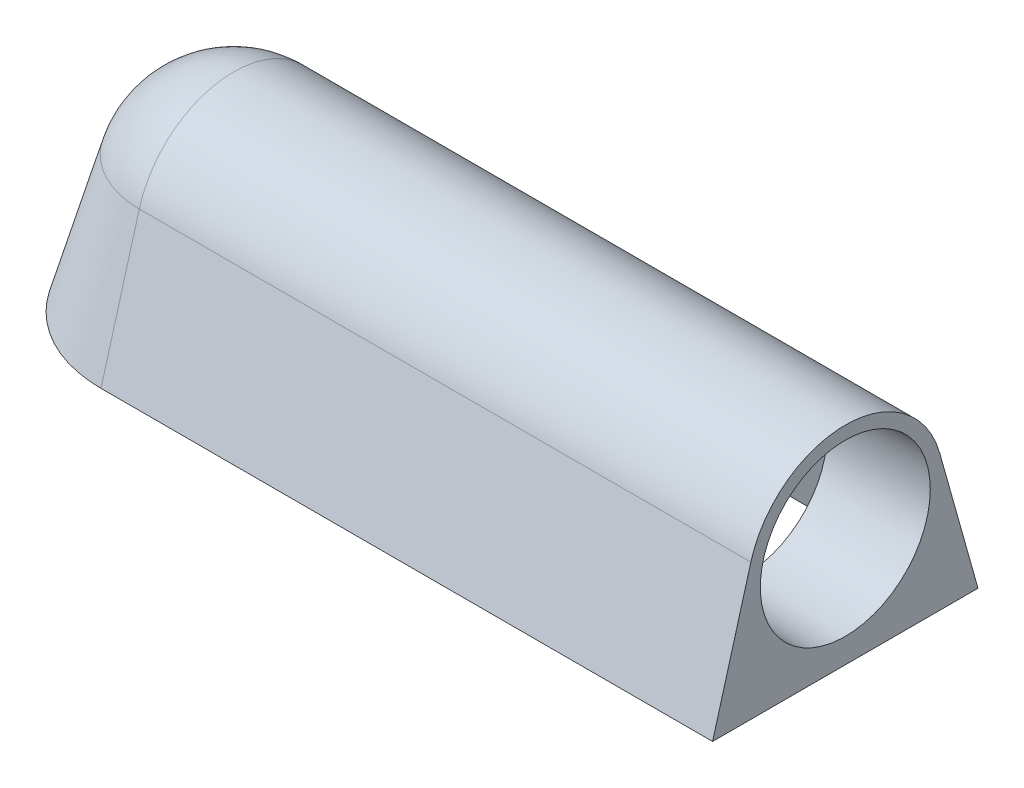
ISO-10303-21;
HEADER;
FILE_DESCRIPTION(('STEP AP214'),'2;1');
FILE_NAME('part.step','',(''),(''),'','','');
FILE_SCHEMA(('AUTOMOTIVE_DESIGN { 1 0 10303 214 1 1 1 1 }'));
ENDSEC;
DATA;
#1=APPLICATION_CONTEXT('core data for automotive mechanical design processes');
#2=APPLICATION_PROTOCOL_DEFINITION('international standard','automotive_design',2000,#1);
#3=PRODUCT_CONTEXT('',#1,'mechanical');
#4=PRODUCT('Part','Part','',(#3));
#5=PRODUCT_RELATED_PRODUCT_CATEGORY('part','',(#4));
#6=PRODUCT_DEFINITION_FORMATION('','',#4);
#7=PRODUCT_DEFINITION_CONTEXT('part definition',#1,'design');
#8=PRODUCT_DEFINITION('design','',#6,#7);
#9=PRODUCT_DEFINITION_SHAPE('','',#8);
#10=(LENGTH_UNIT() NAMED_UNIT(*) SI_UNIT(.MILLI.,.METRE.));
#11=(NAMED_UNIT(*) PLANE_ANGLE_UNIT() SI_UNIT($,.RADIAN.));
#12=(NAMED_UNIT(*) SI_UNIT($,.STERADIAN.) SOLID_ANGLE_UNIT());
#13=UNCERTAINTY_MEASURE_WITH_UNIT(LENGTH_MEASURE(1.E-05),#10,'distance_accuracy_value','');
#14=(GEOMETRIC_REPRESENTATION_CONTEXT(3) GLOBAL_UNCERTAINTY_ASSIGNED_CONTEXT((#13)) GLOBAL_UNIT_ASSIGNED_CONTEXT((#10,
#11,#12)) REPRESENTATION_CONTEXT('',''));
#15=CARTESIAN_POINT('',(0.,0.,0.));
#16=DIRECTION('',(0.,0.,1.));
#17=DIRECTION('',(1.,0.,0.));
#18=AXIS2_PLACEMENT_3D('',#15,#16,#17);
#19=CARTESIAN_POINT('',(0.,9.5,0.));
#20=DIRECTION('',(0.,-1.,0.));
#21=DIRECTION('',(0.,0.,1.));
#22=AXIS2_PLACEMENT_3D('',#19,#20,#21);
#23=SPHERICAL_SURFACE('',#22,8.5);
#24=CARTESIAN_POINT('',(0.,11.8002712503408,0.));
#25=DIRECTION('',(0.,-1.,0.));
#26=DIRECTION('',(0.,0.,-1.));
#27=AXIS2_PLACEMENT_3D('',#24,#25,#26);
#28=CIRCLE('',#27,8.18283277202067);
#29=CARTESIAN_POINT('',(0.,11.8002712503408,8.18283277202068));
#30=VERTEX_POINT('',#29);
#31=CARTESIAN_POINT('',(0.,11.8002712503408,-8.18283277202067));
#32=VERTEX_POINT('',#31);
#33=EDGE_CURVE('E11',#30,#32,#28,.T.);
#34=ORIENTED_EDGE('',*,*,#33,.F.);
#35=CARTESIAN_POINT('',(0.,9.5,0.));
#36=DIRECTION('',(-1.,0.,0.));
#37=DIRECTION('',(0.,0.,-1.));
#38=AXIS2_PLACEMENT_3D('',#35,#36,#37);
#39=CIRCLE('',#38,8.5);
#40=EDGE_CURVE('E227',#30,#32,#39,.T.);
#41=ORIENTED_EDGE('',*,*,#40,.T.);
#42=EDGE_LOOP('',(#34,#41));
#43=FACE_BOUND('',#42,.T.);
#44=ADVANCED_FACE('F32',(#43),#23,.T.);
#45=CARTESIAN_POINT('',(0.,0.,0.));
#46=DIRECTION('',(0.,-1.,0.));
#47=DIRECTION('',(0.,0.,-1.));
#48=AXIS2_PLACEMENT_3D('',#45,#46,#47);
#49=CONICAL_SURFACE('',#48,11.5,0.274037157244348);
#50=CARTESIAN_POINT('',(0.,0.,0.));
#51=DIRECTION('',(0.,-1.,0.));
#52=DIRECTION('',(0.,0.,-1.));
#53=AXIS2_PLACEMENT_3D('',#50,#51,#52);
#54=CIRCLE('',#53,11.5);
#55=CARTESIAN_POINT('',(0.,0.,11.5));
#56=VERTEX_POINT('',#55);
#57=CARTESIAN_POINT('',(0.,0.,-11.5));
#58=VERTEX_POINT('',#57);
#59=EDGE_CURVE('E39',#56,#58,#54,.T.);
#60=ORIENTED_EDGE('',*,*,#59,.F.);
#61=DIRECTION('',(0.,0.96268620847302,-0.270620147098919));
#62=VECTOR('',#61,1.);
#63=CARTESIAN_POINT('',(0.,11.8002712503408,8.18283277202068));
#64=LINE('',#63,#62);
#65=EDGE_CURVE('E223',#56,#30,#64,.T.);
#66=ORIENTED_EDGE('',*,*,#65,.T.);
#67=ORIENTED_EDGE('',*,*,#33,.T.);
#68=DIRECTION('',(0.,0.96268620847302,0.270620147098919));
#69=VECTOR('',#68,1.);
#70=CARTESIAN_POINT('',(0.,11.8002712503408,-8.18283277202067));
#71=LINE('',#70,#69);
#72=EDGE_CURVE('E224',#58,#32,#71,.T.);
#73=ORIENTED_EDGE('',*,*,#72,.F.);
#74=EDGE_LOOP('',(#60,#66,#67,#73));
#75=FACE_BOUND('',#74,.T.);
#76=ADVANCED_FACE('F210',(#75),#49,.T.);
#77=CARTESIAN_POINT('',(0.,0.,11.5));
#78=DIRECTION('',(0.,-1.,0.));
#79=DIRECTION('',(0.,0.,-1.));
#80=AXIS2_PLACEMENT_3D('',#77,#78,#79);
#81=PLANE('',#80);
#82=CARTESIAN_POINT('',(0.,0.,0.));
#83=DIRECTION('',(0.,-1.,0.));
#84=DIRECTION('',(0.,0.,-1.));
#85=AXIS2_PLACEMENT_3D('',#82,#83,#84);
#86=CIRCLE('',#85,10.2534879076502);
#87=CARTESIAN_POINT('',(0.,0.,10.2534879076502));
#88=VERTEX_POINT('',#87);
#89=CARTESIAN_POINT('',(-1.04083408558608E-13,0.,-10.2534879076502));
#90=VERTEX_POINT('',#89);
#91=EDGE_CURVE('E129',#88,#90,#86,.T.);
#92=ORIENTED_EDGE('',*,*,#91,.F.);
#93=DIRECTION('',(-1.,0.,0.));
#94=VECTOR('',#93,1.);
#95=CARTESIAN_POINT('',(53.0000000000001,0.,10.2534879076498));
#96=LINE('',#95,#94);
#97=CARTESIAN_POINT('',(51.8000000000001,0.,10.2534879076498));
#98=VERTEX_POINT('',#97);
#99=EDGE_CURVE('E143',#98,#88,#96,.T.);
#100=ORIENTED_EDGE('',*,*,#99,.F.);
#101=DIRECTION('',(0.,0.,-1.));
#102=VECTOR('',#101,1.);
#103=CARTESIAN_POINT('',(51.8,0.,-3.62711865595565E-13));
#104=LINE('',#103,#102);
#105=CARTESIAN_POINT('',(51.7999999999999,0.,-10.2534879076506));
#106=VERTEX_POINT('',#105);
#107=EDGE_CURVE('E46',#98,#106,#104,.T.);
#108=ORIENTED_EDGE('',*,*,#107,.T.);
#109=DIRECTION('',(-1.,0.,0.));
#110=VECTOR('',#109,1.);
#111=CARTESIAN_POINT('',(0.,0.,-10.2534879076502));
#112=LINE('',#111,#110);
#113=EDGE_CURVE('E151',#106,#90,#112,.T.);
#114=ORIENTED_EDGE('',*,*,#113,.T.);
#115=EDGE_LOOP('',(#92,#100,#108,#114));
#116=FACE_BOUND('',#115,.T.);
#117=ORIENTED_EDGE('',*,*,#59,.T.);
#118=DIRECTION('',(-1.,0.,0.));
#119=VECTOR('',#118,1.);
#120=CARTESIAN_POINT('',(52.9999999999999,0.,-11.5000000000004));
#121=LINE('',#120,#119);
#122=CARTESIAN_POINT('',(52.9999999999999,0.,-11.5000000000004));
#123=VERTEX_POINT('',#122);
#124=EDGE_CURVE('E235',#123,#58,#121,.T.);
#125=ORIENTED_EDGE('',*,*,#124,.F.);
#126=DIRECTION('',(0.,0.,-1.));
#127=VECTOR('',#126,1.);
#128=CARTESIAN_POINT('',(53.0000000000001,0.,11.4999999999996));
#129=LINE('',#128,#127);
#130=CARTESIAN_POINT('',(53.0000000000001,0.,11.4999999999996));
#131=VERTEX_POINT('',#130);
#132=EDGE_CURVE('E245',#131,#123,#129,.T.);
#133=ORIENTED_EDGE('',*,*,#132,.F.);
#134=DIRECTION('',(-1.,0.,0.));
#135=VECTOR('',#134,1.);
#136=CARTESIAN_POINT('',(53.0000000000001,0.,11.4999999999996));
#137=LINE('',#136,#135);
#138=EDGE_CURVE('E233',#131,#56,#137,.T.);
#139=ORIENTED_EDGE('',*,*,#138,.T.);
#140=EDGE_LOOP('',(#117,#125,#133,#139));
#141=FACE_BOUND('',#140,.T.);
#142=ADVANCED_FACE('F207',(#116,#141),#81,.T.);
#143=CARTESIAN_POINT('',(53.0000000000001,11.8002712503408,8.1828327720203));
#144=DIRECTION('',(0.,-0.270620147098919,-0.96268620847302));
#145=DIRECTION('',(0.,0.96268620847302,-0.270620147098919));
#146=AXIS2_PLACEMENT_3D('',#143,#144,#145);
#147=PLANE('',#146);
#148=ORIENTED_EDGE('',*,*,#65,.F.);
#149=ORIENTED_EDGE('',*,*,#138,.F.);
#150=DIRECTION('',(0.,-0.96268620847302,0.270620147098919));
#151=VECTOR('',#150,1.);
#152=CARTESIAN_POINT('',(53.0000000000001,11.8002712503408,8.1828327720203));
#153=LINE('',#152,#151);
#154=CARTESIAN_POINT('',(53.0000000000001,11.8002712503408,8.18283277202031));
#155=VERTEX_POINT('',#154);
#156=EDGE_CURVE('E247',#155,#131,#153,.T.);
#157=ORIENTED_EDGE('',*,*,#156,.F.);
#158=DIRECTION('',(-1.,0.,0.));
#159=VECTOR('',#158,1.);
#160=CARTESIAN_POINT('',(53.0000000000001,11.8002712503408,8.18283277202031));
#161=LINE('',#160,#159);
#162=EDGE_CURVE('E238',#155,#30,#161,.T.);
#163=ORIENTED_EDGE('',*,*,#162,.T.);
#164=EDGE_LOOP('',(#148,#149,#157,#163));
#165=FACE_BOUND('',#164,.T.);
#166=ADVANCED_FACE('F203',(#165),#147,.F.);
#167=CARTESIAN_POINT('',(52.9999999999999,0.,-11.5000000000004));
#168=DIRECTION('',(0.,-0.270620147098919,0.96268620847302));
#169=DIRECTION('',(0.,-0.96268620847302,-0.270620147098919));
#170=AXIS2_PLACEMENT_3D('',#167,#168,#169);
#171=PLANE('',#170);
#172=ORIENTED_EDGE('',*,*,#72,.T.);
#173=DIRECTION('',(-1.,0.,0.));
#174=VECTOR('',#173,1.);
#175=CARTESIAN_POINT('',(52.9999999999999,11.8002712503408,-8.18283277202105));
#176=LINE('',#175,#174);
#177=CARTESIAN_POINT('',(52.9999999999999,11.8002712503408,-8.18283277202105));
#178=VERTEX_POINT('',#177);
#179=EDGE_CURVE('E54',#178,#32,#176,.T.);
#180=ORIENTED_EDGE('',*,*,#179,.F.);
#181=DIRECTION('',(0.,0.96268620847302,0.270620147098919));
#182=VECTOR('',#181,1.);
#183=CARTESIAN_POINT('',(52.9999999999999,0.,-11.5000000000004));
#184=LINE('',#183,#182);
#185=EDGE_CURVE('E243',#123,#178,#184,.T.);
#186=ORIENTED_EDGE('',*,*,#185,.F.);
#187=ORIENTED_EDGE('',*,*,#124,.T.);
#188=EDGE_LOOP('',(#172,#180,#186,#187));
#189=FACE_BOUND('',#188,.T.);
#190=ADVANCED_FACE('F200',(#189),#171,.F.);
#191=CARTESIAN_POINT('',(53.,9.5,-3.70028310750965E-13));
#192=DIRECTION('',(-1.,0.,0.));
#193=DIRECTION('',(0.,0.,1.));
#194=AXIS2_PLACEMENT_3D('',#191,#192,#193);
#195=CYLINDRICAL_SURFACE('',#194,8.5);
#196=ORIENTED_EDGE('',*,*,#40,.F.);
#197=ORIENTED_EDGE('',*,*,#162,.F.);
#198=CARTESIAN_POINT('',(53.,9.5,-3.70028310750965E-13));
#199=DIRECTION('',(1.,0.,0.));
#200=DIRECTION('',(0.,0.,-1.));
#201=AXIS2_PLACEMENT_3D('',#198,#199,#200);
#202=CIRCLE('',#201,8.5);
#203=EDGE_CURVE('E241',#178,#155,#202,.T.);
#204=ORIENTED_EDGE('',*,*,#203,.F.);
#205=ORIENTED_EDGE('',*,*,#179,.T.);
#206=EDGE_LOOP('',(#196,#197,#204,#205));
#207=FACE_BOUND('',#206,.T.);
#208=ADVANCED_FACE('F196',(#207),#195,.T.);
#209=CARTESIAN_POINT('',(53.,9.5,-3.70028310750965E-13));
#210=DIRECTION('',(1.,0.,0.));
#211=DIRECTION('',(0.,0.,-1.));
#212=AXIS2_PLACEMENT_3D('',#209,#210,#211);
#213=PLANE('',#212);
#214=CARTESIAN_POINT('',(52.9999999999551,9.5,-3.70146621686551E-13));
#215=DIRECTION('',(1.,0.,0.));
#216=DIRECTION('',(0.,0.,-1.));
#217=AXIS2_PLACEMENT_3D('',#214,#215,#216);
#218=CIRCLE('',#217,7.366);
#219=CARTESIAN_POINT('',(52.999999999955,9.5,-7.36600000000037));
#220=VERTEX_POINT('',#219);
#221=EDGE_CURVE('E250',#220,#220,#218,.T.);
#222=ORIENTED_EDGE('',*,*,#221,.F.);
#223=EDGE_LOOP('',(#222));
#224=FACE_BOUND('',#223,.T.);
#225=ORIENTED_EDGE('',*,*,#156,.T.);
#226=ORIENTED_EDGE('',*,*,#132,.T.);
#227=ORIENTED_EDGE('',*,*,#185,.T.);
#228=ORIENTED_EDGE('',*,*,#203,.T.);
#229=EDGE_LOOP('',(#225,#226,#227,#228));
#230=FACE_BOUND('',#229,.T.);
#231=ADVANCED_FACE('F192',(#224,#230),#213,.T.);
#232=CARTESIAN_POINT('',(52.9999999999551,9.5,-3.70146621686551E-13));
#233=DIRECTION('',(1.,0.,0.));
#234=DIRECTION('',(0.,0.,-1.));
#235=AXIS2_PLACEMENT_3D('',#232,#233,#234);
#236=CONICAL_SURFACE('',#235,7.366,0.0349065850398867);
#237=CARTESIAN_POINT('',(44.3639999999551,9.5,-3.09312936049889E-13));
#238=DIRECTION('',(1.,0.,0.));
#239=DIRECTION('',(0.,0.,-1.));
#240=AXIS2_PLACEMENT_3D('',#237,#238,#239);
#241=CIRCLE('',#240,7.06442423466926);
#242=CARTESIAN_POINT('',(44.363999999955,9.5,-7.06442423466957));
#243=VERTEX_POINT('',#242);
#244=EDGE_CURVE('E251',#243,#243,#241,.T.);
#245=ORIENTED_EDGE('',*,*,#244,.F.);
#246=EDGE_LOOP('',(#245));
#247=FACE_BOUND('',#246,.T.);
#248=ORIENTED_EDGE('',*,*,#221,.T.);
#249=EDGE_LOOP('',(#248));
#250=FACE_BOUND('',#249,.T.);
#251=ADVANCED_FACE('F188',(#247,#250),#236,.F.);
#252=CARTESIAN_POINT('',(53.,11.4755270738221,7.02760932185268));
#253=DIRECTION('',(0.,-0.270620147098919,-0.96268620847302));
#254=DIRECTION('',(0.,0.96268620847302,-0.270620147098919));
#255=AXIS2_PLACEMENT_3D('',#252,#253,#254);
#256=PLANE('',#255);
#257=DIRECTION('',(0.,-0.96268620847302,0.270620147098919));
#258=VECTOR('',#257,1.);
#259=CARTESIAN_POINT('',(44.3639999999551,11.4755270738221,7.02760932185274));
#260=LINE('',#259,#258);
#261=CARTESIAN_POINT('',(44.3639999999551,11.4755270738221,7.02760932185274));
#262=VERTEX_POINT('',#261);
#263=CARTESIAN_POINT('',(44.3639999999551,7.74422704214361,8.07651285298849));
#264=VERTEX_POINT('',#263);
#265=EDGE_CURVE('E258',#262,#264,#260,.T.);
#266=ORIENTED_EDGE('',*,*,#265,.T.);
#267=CARTESIAN_POINT('',(64.7275807946575,6.44708054759679,8.44115293204371));
#268=CARTESIAN_POINT('',(63.6500352944031,6.5093351433632,8.42365257968008));
#269=CARTESIAN_POINT('',(62.5725371180742,6.57234431265899,8.40594010960071));
#270=CARTESIAN_POINT('',(60.4176496541625,6.70007451351936,8.37003394885845));
#271=CARTESIAN_POINT('',(59.3402603666462,6.76479554612519,8.35184025790285));
#272=CARTESIAN_POINT('',(56.1083381456672,6.96182680158969,8.29645291894694));
#273=CARTESIAN_POINT('',(53.9539918594332,7.09700856817742,8.25845205299803));
#274=CARTESIAN_POINT('',(50.7229863747897,7.30734000712617,8.19932590737879));
#275=CARTESIAN_POINT('',(49.6460613591914,7.37871090231477,8.17926287751037));
#276=CARTESIAN_POINT('',(47.4924286070599,7.5244140718067,8.13830434625311));
#277=CARTESIAN_POINT('',(46.4157208702097,7.59874634175603,8.11740884608823));
#278=CARTESIAN_POINT('',(44.2625418552945,7.7509009645167,8.07463675064233));
#279=CARTESIAN_POINT('',(43.1860705841891,7.82872340901747,8.05276012958655));
#280=CARTESIAN_POINT('',(41.0334655030667,7.98864087722283,8.00780582527793));
#281=CARTESIAN_POINT('',(39.9573316948225,8.07073592300825,7.98472813581796));
#282=CARTESIAN_POINT('',(38.8814085270705,8.15535902964402,7.96093978467699));
#283=B_SPLINE_CURVE_WITH_KNOTS('',3,(#267,#268,#269,#270,#271,#272,#273,#274,#275,#276,#277,
#278,#279,#280,#281,#282),.UNSPECIFIED.,.F.,.F.,(4,2,2,2,2,2,2,4),(0.,3.2384516456017,
6.47690526107928,12.9536351955402,16.1920533704621,19.4304667842243,22.668965323358,
25.9074806007426),.UNSPECIFIED.);
#284=CARTESIAN_POINT('',(51.8000000000001,7.23722875951779,8.21903483846565));
#285=VERTEX_POINT('',#284);
#286=EDGE_CURVE('E139',#285,#264,#283,.T.);
#287=ORIENTED_EDGE('',*,*,#286,.F.);
#288=DIRECTION('',(0.,-0.96268620847302,0.270620147098919));
#289=VECTOR('',#288,1.);
#290=CARTESIAN_POINT('',(51.8,11.4755270738221,7.02760932185269));
#291=LINE('',#290,#289);
#292=EDGE_CURVE('E147',#285,#98,#291,.T.);
#293=ORIENTED_EDGE('',*,*,#292,.T.);
#294=ORIENTED_EDGE('',*,*,#99,.T.);
#295=DIRECTION('',(0.,-0.96268620847302,0.270620147098919));
#296=VECTOR('',#295,1.);
#297=CARTESIAN_POINT('',(0.,-0.324744176518708,10.3447765498324));
#298=LINE('',#297,#296);
#299=CARTESIAN_POINT('',(0.,11.4755270738221,7.02760932185306));
#300=VERTEX_POINT('',#299);
#301=EDGE_CURVE('E130',#88,#300,#298,.F.);
#302=ORIENTED_EDGE('',*,*,#301,.T.);
#303=DIRECTION('',(1.,0.,0.));
#304=VECTOR('',#303,1.);
#305=CARTESIAN_POINT('',(53.,11.4755270738221,7.02760932185268));
#306=LINE('',#305,#304);
#307=EDGE_CURVE('E111',#262,#300,#306,.F.);
#308=ORIENTED_EDGE('',*,*,#307,.F.);
#309=EDGE_LOOP('',(#266,#287,#293,#294,#302,#308));
#310=FACE_BOUND('',#309,.T.);
#311=ADVANCED_FACE('F141',(#310),#256,.T.);
#312=CARTESIAN_POINT('',(0.,9.5,0.));
#313=DIRECTION('',(0.,-1.,0.));
#314=DIRECTION('',(0.,0.,1.));
#315=AXIS2_PLACEMENT_3D('',#312,#313,#314);
#316=SPHERICAL_SURFACE('',#315,7.3);
#317=CARTESIAN_POINT('',(0.,11.4755270738221,0.));
#318=DIRECTION('',(0.,-1.,0.));
#319=DIRECTION('',(0.,0.,-1.));
#320=AXIS2_PLACEMENT_3D('',#317,#318,#319);
#321=CIRCLE('',#320,7.02760932185305);
#322=CARTESIAN_POINT('',(0.,11.4755270738221,-7.02760932185305));
#323=VERTEX_POINT('',#322);
#324=EDGE_CURVE('E128',#300,#323,#321,.T.);
#325=ORIENTED_EDGE('',*,*,#324,.T.);
#326=CARTESIAN_POINT('',(0.,9.5,0.));
#327=DIRECTION('',(-1.,0.,0.));
#328=DIRECTION('',(0.,0.,1.));
#329=AXIS2_PLACEMENT_3D('',#326,#327,#328);
#330=CIRCLE('',#329,7.3);
#331=EDGE_CURVE('E115',#300,#323,#330,.T.);
#332=ORIENTED_EDGE('',*,*,#331,.F.);
#333=EDGE_LOOP('',(#325,#332));
#334=FACE_BOUND('',#333,.T.);
#335=ADVANCED_FACE('F127',(#334),#316,.F.);
#336=CARTESIAN_POINT('',(0.,-0.324744176518706,0.));
#337=DIRECTION('',(0.,-1.,0.));
#338=DIRECTION('',(0.,0.,-1.));
#339=AXIS2_PLACEMENT_3D('',#336,#337,#338);
#340=CONICAL_SURFACE('',#339,10.3447765498324,0.274037157244348);
#341=ORIENTED_EDGE('',*,*,#91,.T.);
#342=DIRECTION('',(0.,-0.96268620847302,-0.270620147098919));
#343=VECTOR('',#342,1.);
#344=CARTESIAN_POINT('',(-1.04083408558608E-13,-0.3247441765188,-10.3447765498324));
#345=LINE('',#344,#343);
#346=EDGE_CURVE('E138',#90,#323,#345,.F.);
#347=ORIENTED_EDGE('',*,*,#346,.T.);
#348=ORIENTED_EDGE('',*,*,#324,.F.);
#349=ORIENTED_EDGE('',*,*,#301,.F.);
#350=EDGE_LOOP('',(#341,#347,#348,#349));
#351=FACE_BOUND('',#350,.T.);
#352=ADVANCED_FACE('F135',(#351),#340,.F.);
#353=CARTESIAN_POINT('',(52.9999999999999,-0.324744176518703,-10.3447765498328));
#354=DIRECTION('',(0.,-0.270620147098919,0.96268620847302));
#355=DIRECTION('',(0.,-0.96268620847302,-0.270620147098919));
#356=AXIS2_PLACEMENT_3D('',#353,#354,#355);
#357=PLANE('',#356);
#358=DIRECTION('',(-1.,0.,0.));
#359=VECTOR('',#358,1.);
#360=CARTESIAN_POINT('',(53.,11.4755270738221,-7.02760932185342));
#361=LINE('',#360,#359);
#362=CARTESIAN_POINT('',(44.363999999955,11.4755270738221,-7.02760932185336));
#363=VERTEX_POINT('',#362);
#364=EDGE_CURVE('E122',#363,#323,#361,.T.);
#365=ORIENTED_EDGE('',*,*,#364,.T.);
#366=ORIENTED_EDGE('',*,*,#346,.F.);
#367=ORIENTED_EDGE('',*,*,#113,.F.);
#368=DIRECTION('',(0.,0.96268620847302,0.270620147098919));
#369=VECTOR('',#368,1.);
#370=CARTESIAN_POINT('',(51.7999999999999,-0.324744176518703,-10.3447765498327));
#371=LINE('',#370,#369);
#372=CARTESIAN_POINT('',(51.7999999999999,7.23722875951779,-8.21903483846637));
#373=VERTEX_POINT('',#372);
#374=EDGE_CURVE('E123',#106,#373,#371,.T.);
#375=ORIENTED_EDGE('',*,*,#374,.T.);
#376=CARTESIAN_POINT('',(64.7275807946574,6.4470805475968,-8.44115293204461));
#377=CARTESIAN_POINT('',(63.6500352944029,6.5093351433632,-8.42365257968097));
#378=CARTESIAN_POINT('',(62.5725371180741,6.572344312659,-8.40594010960158));
#379=CARTESIAN_POINT('',(60.4176496541623,6.70007451351936,-8.37003394885929));
#380=CARTESIAN_POINT('',(59.3402603666461,6.7647955461252,-8.35184025790367));
#381=CARTESIAN_POINT('',(56.1083381456671,6.9618268015897,-8.29645291894773));
#382=CARTESIAN_POINT('',(53.953991859433,7.09700856817743,-8.25845205299879));
#383=CARTESIAN_POINT('',(50.7229863747896,7.30734000712618,-8.1993259073795));
#384=CARTESIAN_POINT('',(49.6460613591913,7.37871090231477,-8.17926287751106));
#385=CARTESIAN_POINT('',(47.4924286070598,7.5244140718067,-8.13830434625377));
#386=CARTESIAN_POINT('',(46.4157208702096,7.59874634175603,-8.11740884608888));
#387=CARTESIAN_POINT('',(44.2625418552944,7.7509009645167,-8.07463675064295));
#388=CARTESIAN_POINT('',(43.1860705841891,7.82872340901747,-8.05276012958715));
#389=CARTESIAN_POINT('',(41.0334655030666,7.98864087722283,-8.00780582527851));
#390=CARTESIAN_POINT('',(39.9573316948224,8.07073592300826,-7.98472813581852));
#391=CARTESIAN_POINT('',(38.8814085270704,8.15535902964403,-7.96093978467753));
#392=B_SPLINE_CURVE_WITH_KNOTS('',3,(#376,#377,#378,#379,#380,#381,#382,#383,#384,#385,#386,
#387,#388,#389,#390,#391),.UNSPECIFIED.,.F.,.F.,(4,2,2,2,2,2,2,4),(0.,3.2384516456017,
6.47690526107927,12.9536351955402,16.1920533704621,19.4304667842243,22.668965323358,
25.9074806007426),.UNSPECIFIED.);
#393=CARTESIAN_POINT('',(44.363999999955,7.74422704214361,-8.07651285298911));
#394=VERTEX_POINT('',#393);
#395=EDGE_CURVE('E171',#373,#394,#392,.T.);
#396=ORIENTED_EDGE('',*,*,#395,.T.);
#397=DIRECTION('',(0.,-0.96268620847302,-0.270620147098919));
#398=VECTOR('',#397,1.);
#399=CARTESIAN_POINT('',(44.363999999955,11.4755270738221,-7.02760932185336));
#400=LINE('',#399,#398);
#401=EDGE_CURVE('E257',#363,#394,#400,.T.);
#402=ORIENTED_EDGE('',*,*,#401,.F.);
#403=EDGE_LOOP('',(#365,#366,#367,#375,#396,#402));
#404=FACE_BOUND('',#403,.T.);
#405=ADVANCED_FACE('F261',(#404),#357,.T.);
#406=CARTESIAN_POINT('',(53.,9.5,-3.70028310750965E-13));
#407=DIRECTION('',(-1.,0.,0.));
#408=DIRECTION('',(0.,0.,1.));
#409=AXIS2_PLACEMENT_3D('',#406,#407,#408);
#410=CYLINDRICAL_SURFACE('',#409,7.3);
#411=ORIENTED_EDGE('',*,*,#307,.T.);
#412=ORIENTED_EDGE('',*,*,#331,.T.);
#413=ORIENTED_EDGE('',*,*,#364,.F.);
#414=CARTESIAN_POINT('',(44.3639999999551,9.5,-3.09194625113986E-13));
#415=DIRECTION('',(1.,0.,0.));
#416=DIRECTION('',(0.,0.,-1.));
#417=AXIS2_PLACEMENT_3D('',#414,#415,#416);
#418=CIRCLE('',#417,7.3);
#419=EDGE_CURVE('E118',#262,#363,#418,.F.);
#420=ORIENTED_EDGE('',*,*,#419,.F.);
#421=EDGE_LOOP('',(#411,#412,#413,#420));
#422=FACE_BOUND('',#421,.T.);
#423=ADVANCED_FACE('F113',(#422),#410,.F.);
#424=CARTESIAN_POINT('',(51.8,9.5,-3.61575274303073E-13));
#425=DIRECTION('',(1.,0.,0.));
#426=DIRECTION('',(0.,0.,-1.));
#427=AXIS2_PLACEMENT_3D('',#424,#425,#426);
#428=PLANE('',#427);
#429=CARTESIAN_POINT('',(51.8,9.5,-3.61693585238976E-13));
#430=DIRECTION('',(1.,0.,0.));
#431=DIRECTION('',(0.,0.,-1.));
#432=AXIS2_PLACEMENT_3D('',#429,#430,#431);
#433=CIRCLE('',#432,8.52482652977005);
#434=EDGE_CURVE('E154',#285,#373,#433,.T.);
#435=ORIENTED_EDGE('',*,*,#434,.T.);
#436=ORIENTED_EDGE('',*,*,#374,.F.);
#437=ORIENTED_EDGE('',*,*,#107,.F.);
#438=ORIENTED_EDGE('',*,*,#292,.F.);
#439=EDGE_LOOP('',(#435,#436,#437,#438));
#440=FACE_BOUND('',#439,.T.);
#441=ADVANCED_FACE('F185',(#440),#428,.F.);
#442=CARTESIAN_POINT('',(52.9581206039121,9.5,-3.69851614968912E-13));
#443=DIRECTION('',(1.,0.,0.));
#444=DIRECTION('',(0.,0.,-1.));
#445=AXIS2_PLACEMENT_3D('',#442,#443,#444);
#446=CONICAL_SURFACE('',#445,8.56526899242291,0.0349065850398867);
#447=ORIENTED_EDGE('',*,*,#434,.F.);
#448=ORIENTED_EDGE('',*,*,#286,.T.);
#449=CARTESIAN_POINT('',(44.3639999999551,9.5,-3.09312936049889E-13));
#450=DIRECTION('',(1.,0.,0.));
#451=DIRECTION('',(0.,0.,-1.));
#452=AXIS2_PLACEMENT_3D('',#449,#450,#451);
#453=CIRCLE('',#452,8.26515568782785);
#454=EDGE_CURVE('E148',#264,#394,#453,.T.);
#455=ORIENTED_EDGE('',*,*,#454,.T.);
#456=ORIENTED_EDGE('',*,*,#395,.F.);
#457=EDGE_LOOP('',(#447,#448,#455,#456));
#458=FACE_BOUND('',#457,.T.);
#459=ADVANCED_FACE('F179',(#458),#446,.T.);
#460=CARTESIAN_POINT('',(44.3639999999551,9.5,-3.09312936049889E-13));
#461=DIRECTION('',(1.,0.,0.));
#462=DIRECTION('',(0.,0.,-1.));
#463=AXIS2_PLACEMENT_3D('',#460,#461,#462);
#464=PLANE('',#463);
#465=ORIENTED_EDGE('',*,*,#244,.T.);
#466=EDGE_LOOP('',(#465));
#467=FACE_BOUND('',#466,.T.);
#468=ORIENTED_EDGE('',*,*,#419,.T.);
#469=ORIENTED_EDGE('',*,*,#401,.T.);
#470=ORIENTED_EDGE('',*,*,#454,.F.);
#471=ORIENTED_EDGE('',*,*,#265,.F.);
#472=EDGE_LOOP('',(#468,#469,#470,#471));
#473=FACE_BOUND('',#472,.T.);
#474=ADVANCED_FACE('F184',(#467,#473),#464,.F.);
#475=CLOSED_SHELL('',(#44,#76,#142,#166,#190,#208,#231,#251,#311,#335,#352,#405,#423,#441,#459,#474));
#476=MANIFOLD_SOLID_BREP('B2',#475);
#477=ADVANCED_BREP_SHAPE_REPRESENTATION('',(#18,#476),#14);
#478=SHAPE_DEFINITION_REPRESENTATION(#9,#477);
ENDSEC;
END-ISO-10303-21;
